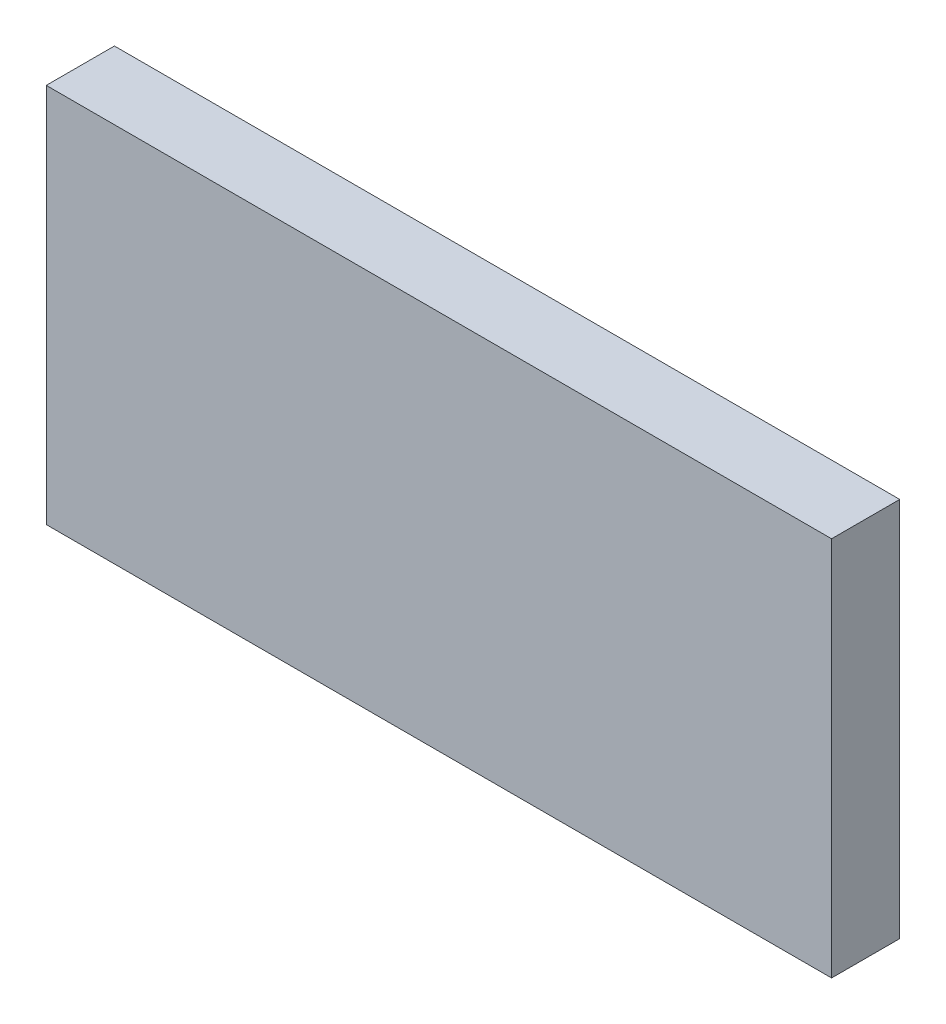
ISO-10303-21;
HEADER;
FILE_DESCRIPTION(('STEP AP214'),'2;1');
FILE_NAME('part.step','',(''),(''),'','','');
FILE_SCHEMA(('AUTOMOTIVE_DESIGN { 1 0 10303 214 1 1 1 1 }'));
ENDSEC;
DATA;
#1=APPLICATION_CONTEXT('core data for automotive mechanical design processes');
#2=APPLICATION_PROTOCOL_DEFINITION('international standard','automotive_design',2000,#1);
#3=PRODUCT_CONTEXT('',#1,'mechanical');
#4=PRODUCT('Part','Part','',(#3));
#5=PRODUCT_RELATED_PRODUCT_CATEGORY('part','',(#4));
#6=PRODUCT_DEFINITION_FORMATION('','',#4);
#7=PRODUCT_DEFINITION_CONTEXT('part definition',#1,'design');
#8=PRODUCT_DEFINITION('design','',#6,#7);
#9=PRODUCT_DEFINITION_SHAPE('','',#8);
#10=(LENGTH_UNIT() NAMED_UNIT(*) SI_UNIT(.MILLI.,.METRE.));
#11=(NAMED_UNIT(*) PLANE_ANGLE_UNIT() SI_UNIT($,.RADIAN.));
#12=(NAMED_UNIT(*) SI_UNIT($,.STERADIAN.) SOLID_ANGLE_UNIT());
#13=UNCERTAINTY_MEASURE_WITH_UNIT(LENGTH_MEASURE(1.E-05),#10,'distance_accuracy_value','');
#14=(GEOMETRIC_REPRESENTATION_CONTEXT(3) GLOBAL_UNCERTAINTY_ASSIGNED_CONTEXT((#13)) GLOBAL_UNIT_ASSIGNED_CONTEXT((#10,
#11,#12)) REPRESENTATION_CONTEXT('',''));
#15=CARTESIAN_POINT('',(0.,0.,0.));
#16=DIRECTION('',(0.,0.,1.));
#17=DIRECTION('',(1.,0.,0.));
#18=AXIS2_PLACEMENT_3D('',#15,#16,#17);
#19=CARTESIAN_POINT('',(-28.1747899159664,19.6711260504202,4.23333333333333));
#20=DIRECTION('',(1.,0.,0.));
#21=DIRECTION('',(0.,0.,-1.));
#22=AXIS2_PLACEMENT_3D('',#19,#20,#21);
#23=PLANE('',#22);
#24=DIRECTION('',(0.,-1.,0.));
#25=VECTOR('',#24,1.);
#26=CARTESIAN_POINT('',(-28.1747899159664,19.6711260504202,0.));
#27=LINE('',#26,#25);
#28=CARTESIAN_POINT('',(-28.1747899159664,19.6711260504202,0.));
#29=VERTEX_POINT('',#28);
#30=CARTESIAN_POINT('',(-28.1747899159664,-3.95087394957983,0.));
#31=VERTEX_POINT('',#30);
#32=EDGE_CURVE('E113',#29,#31,#27,.T.);
#33=ORIENTED_EDGE('',*,*,#32,.T.);
#34=DIRECTION('',(0.,0.,-1.));
#35=VECTOR('',#34,1.);
#36=CARTESIAN_POINT('',(-28.1747899159664,-3.95087394957983,4.23333333333333));
#37=LINE('',#36,#35);
#38=CARTESIAN_POINT('',(-28.1747899159664,-3.95087394957983,4.23333333333333));
#39=VERTEX_POINT('',#38);
#40=EDGE_CURVE('E11',#39,#31,#37,.T.);
#41=ORIENTED_EDGE('',*,*,#40,.F.);
#42=DIRECTION('',(0.,-1.,0.));
#43=VECTOR('',#42,1.);
#44=CARTESIAN_POINT('',(-28.1747899159664,19.6711260504202,4.23333333333333));
#45=LINE('',#44,#43);
#46=CARTESIAN_POINT('',(-28.1747899159664,19.6711260504202,4.23333333333333));
#47=VERTEX_POINT('',#46);
#48=EDGE_CURVE('E97',#47,#39,#45,.T.);
#49=ORIENTED_EDGE('',*,*,#48,.F.);
#50=DIRECTION('',(0.,0.,-1.));
#51=VECTOR('',#50,1.);
#52=CARTESIAN_POINT('',(-28.1747899159664,19.6711260504202,4.23333333333333));
#53=LINE('',#52,#51);
#54=EDGE_CURVE('E109',#47,#29,#53,.T.);
#55=ORIENTED_EDGE('',*,*,#54,.T.);
#56=EDGE_LOOP('',(#33,#41,#49,#55));
#57=FACE_BOUND('',#56,.T.);
#58=ADVANCED_FACE('F45',(#57),#23,.F.);
#59=CARTESIAN_POINT('',(-28.1747899159664,-3.95087394957983,4.23333333333333));
#60=DIRECTION('',(0.,1.,0.));
#61=DIRECTION('',(0.,0.,1.));
#62=AXIS2_PLACEMENT_3D('',#59,#60,#61);
#63=PLANE('',#62);
#64=DIRECTION('',(1.,0.,0.));
#65=VECTOR('',#64,1.);
#66=CARTESIAN_POINT('',(-28.1747899159664,-3.95087394957983,0.));
#67=LINE('',#66,#65);
#68=CARTESIAN_POINT('',(20.5932100840336,-3.95087394957983,0.));
#69=VERTEX_POINT('',#68);
#70=EDGE_CURVE('E102',#31,#69,#67,.T.);
#71=ORIENTED_EDGE('',*,*,#70,.T.);
#72=DIRECTION('',(0.,0.,-1.));
#73=VECTOR('',#72,1.);
#74=CARTESIAN_POINT('',(20.5932100840336,-3.95087394957983,4.23333333333333));
#75=LINE('',#74,#73);
#76=CARTESIAN_POINT('',(20.5932100840336,-3.95087394957983,4.23333333333333));
#77=VERTEX_POINT('',#76);
#78=EDGE_CURVE('E54',#77,#69,#75,.T.);
#79=ORIENTED_EDGE('',*,*,#78,.F.);
#80=DIRECTION('',(1.,0.,0.));
#81=VECTOR('',#80,1.);
#82=CARTESIAN_POINT('',(-28.1747899159664,-3.95087394957983,4.23333333333333));
#83=LINE('',#82,#81);
#84=EDGE_CURVE('E92',#39,#77,#83,.T.);
#85=ORIENTED_EDGE('',*,*,#84,.F.);
#86=ORIENTED_EDGE('',*,*,#40,.T.);
#87=EDGE_LOOP('',(#71,#79,#85,#86));
#88=FACE_BOUND('',#87,.T.);
#89=ADVANCED_FACE('F101',(#88),#63,.F.);
#90=CARTESIAN_POINT('',(20.5932100840336,19.6711260504202,4.23333333333333));
#91=DIRECTION('',(-1.,0.,0.));
#92=DIRECTION('',(0.,-1.,0.));
#93=AXIS2_PLACEMENT_3D('',#90,#91,#92);
#94=PLANE('',#93);
#95=DIRECTION('',(0.,1.,0.));
#96=VECTOR('',#95,1.);
#97=CARTESIAN_POINT('',(20.5932100840336,19.6711260504202,0.));
#98=LINE('',#97,#96);
#99=CARTESIAN_POINT('',(20.5932100840336,19.6711260504202,0.));
#100=VERTEX_POINT('',#99);
#101=EDGE_CURVE('E79',#69,#100,#98,.T.);
#102=ORIENTED_EDGE('',*,*,#101,.T.);
#103=DIRECTION('',(0.,0.,-1.));
#104=VECTOR('',#103,1.);
#105=CARTESIAN_POINT('',(20.5932100840336,19.6711260504202,4.23333333333333));
#106=LINE('',#105,#104);
#107=CARTESIAN_POINT('',(20.5932100840336,19.6711260504202,4.23333333333333));
#108=VERTEX_POINT('',#107);
#109=EDGE_CURVE('E104',#108,#100,#106,.T.);
#110=ORIENTED_EDGE('',*,*,#109,.F.);
#111=DIRECTION('',(0.,1.,0.));
#112=VECTOR('',#111,1.);
#113=CARTESIAN_POINT('',(20.5932100840336,19.6711260504202,4.23333333333333));
#114=LINE('',#113,#112);
#115=EDGE_CURVE('E95',#77,#108,#114,.T.);
#116=ORIENTED_EDGE('',*,*,#115,.F.);
#117=ORIENTED_EDGE('',*,*,#78,.T.);
#118=EDGE_LOOP('',(#102,#110,#116,#117));
#119=FACE_BOUND('',#118,.T.);
#120=ADVANCED_FACE('F105',(#119),#94,.F.);
#121=CARTESIAN_POINT('',(-28.1747899159664,19.6711260504202,4.23333333333333));
#122=DIRECTION('',(0.,-1.,0.));
#123=DIRECTION('',(0.,0.,-1.));
#124=AXIS2_PLACEMENT_3D('',#121,#122,#123);
#125=PLANE('',#124);
#126=DIRECTION('',(-1.,0.,0.));
#127=VECTOR('',#126,1.);
#128=CARTESIAN_POINT('',(-28.1747899159664,19.6711260504202,0.));
#129=LINE('',#128,#127);
#130=EDGE_CURVE('E85',#100,#29,#129,.T.);
#131=ORIENTED_EDGE('',*,*,#130,.T.);
#132=ORIENTED_EDGE('',*,*,#54,.F.);
#133=DIRECTION('',(-1.,0.,0.));
#134=VECTOR('',#133,1.);
#135=CARTESIAN_POINT('',(-28.1747899159664,19.6711260504202,4.23333333333333));
#136=LINE('',#135,#134);
#137=EDGE_CURVE('E62',#108,#47,#136,.T.);
#138=ORIENTED_EDGE('',*,*,#137,.F.);
#139=ORIENTED_EDGE('',*,*,#109,.T.);
#140=EDGE_LOOP('',(#131,#132,#138,#139));
#141=FACE_BOUND('',#140,.T.);
#142=ADVANCED_FACE('F126',(#141),#125,.F.);
#143=CARTESIAN_POINT('',(0.,0.,4.23333333333333));
#144=DIRECTION('',(0.,0.,1.));
#145=DIRECTION('',(1.,0.,0.));
#146=AXIS2_PLACEMENT_3D('',#143,#144,#145);
#147=PLANE('',#146);
#148=ORIENTED_EDGE('',*,*,#48,.T.);
#149=ORIENTED_EDGE('',*,*,#84,.T.);
#150=ORIENTED_EDGE('',*,*,#115,.T.);
#151=ORIENTED_EDGE('',*,*,#137,.T.);
#152=EDGE_LOOP('',(#148,#149,#150,#151));
#153=FACE_BOUND('',#152,.T.);
#154=ADVANCED_FACE('F93',(#153),#147,.T.);
#155=CARTESIAN_POINT('',(0.,0.,0.));
#156=DIRECTION('',(0.,0.,1.));
#157=DIRECTION('',(1.,0.,0.));
#158=AXIS2_PLACEMENT_3D('',#155,#156,#157);
#159=PLANE('',#158);
#160=ORIENTED_EDGE('',*,*,#32,.F.);
#161=ORIENTED_EDGE('',*,*,#130,.F.);
#162=ORIENTED_EDGE('',*,*,#101,.F.);
#163=ORIENTED_EDGE('',*,*,#70,.F.);
#164=EDGE_LOOP('',(#160,#161,#162,#163));
#165=FACE_BOUND('',#164,.T.);
#166=ADVANCED_FACE('F129',(#165),#159,.F.);
#167=CLOSED_SHELL('',(#58,#89,#120,#142,#154,#166));
#168=MANIFOLD_SOLID_BREP('B2',#167);
#169=ADVANCED_BREP_SHAPE_REPRESENTATION('',(#18,#168),#14);
#170=SHAPE_DEFINITION_REPRESENTATION(#9,#169);
ENDSEC;
END-ISO-10303-21;
